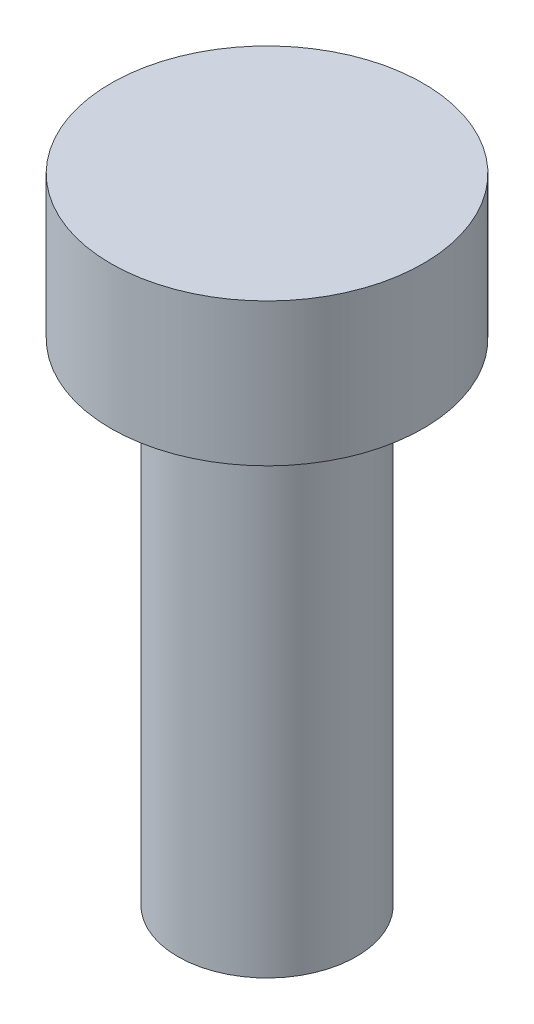
ISO-10303-21;
HEADER;
FILE_DESCRIPTION(('STEP AP214'),'2;1');
FILE_NAME('part.step','',(''),(''),'','','');
FILE_SCHEMA(('AUTOMOTIVE_DESIGN { 1 0 10303 214 1 1 1 1 }'));
ENDSEC;
DATA;
#1=APPLICATION_CONTEXT('core data for automotive mechanical design processes');
#2=APPLICATION_PROTOCOL_DEFINITION('international standard','automotive_design',2000,#1);
#3=PRODUCT_CONTEXT('',#1,'mechanical');
#4=PRODUCT('Part','Part','',(#3));
#5=PRODUCT_RELATED_PRODUCT_CATEGORY('part','',(#4));
#6=PRODUCT_DEFINITION_FORMATION('','',#4);
#7=PRODUCT_DEFINITION_CONTEXT('part definition',#1,'design');
#8=PRODUCT_DEFINITION('design','',#6,#7);
#9=PRODUCT_DEFINITION_SHAPE('','',#8);
#10=(LENGTH_UNIT() NAMED_UNIT(*) SI_UNIT(.MILLI.,.METRE.));
#11=(NAMED_UNIT(*) PLANE_ANGLE_UNIT() SI_UNIT($,.RADIAN.));
#12=(NAMED_UNIT(*) SI_UNIT($,.STERADIAN.) SOLID_ANGLE_UNIT());
#13=UNCERTAINTY_MEASURE_WITH_UNIT(LENGTH_MEASURE(1.E-05),#10,'distance_accuracy_value','');
#14=(GEOMETRIC_REPRESENTATION_CONTEXT(3) GLOBAL_UNCERTAINTY_ASSIGNED_CONTEXT((#13)) GLOBAL_UNIT_ASSIGNED_CONTEXT((#10,
#11,#12)) REPRESENTATION_CONTEXT('',''));
#15=CARTESIAN_POINT('',(0.,0.,0.));
#16=DIRECTION('',(0.,0.,1.));
#17=DIRECTION('',(1.,0.,0.));
#18=AXIS2_PLACEMENT_3D('',#15,#16,#17);
#19=CARTESIAN_POINT('',(0.,1.6,0.));
#20=DIRECTION('',(0.,-1.,0.));
#21=DIRECTION('',(0.,0.,-1.));
#22=AXIS2_PLACEMENT_3D('',#19,#20,#21);
#23=CYLINDRICAL_SURFACE('',#22,1.75);
#24=CARTESIAN_POINT('',(0.,1.6,0.));
#25=DIRECTION('',(0.,1.,0.));
#26=DIRECTION('',(0.,0.,1.));
#27=AXIS2_PLACEMENT_3D('',#24,#25,#26);
#28=CIRCLE('',#27,1.75);
#29=CARTESIAN_POINT('',(0.,1.6,1.75));
#30=VERTEX_POINT('',#29);
#31=EDGE_CURVE('E37',#30,#30,#28,.T.);
#32=ORIENTED_EDGE('',*,*,#31,.F.);
#33=EDGE_LOOP('',(#32));
#34=FACE_BOUND('',#33,.T.);
#35=CARTESIAN_POINT('',(0.,0.,0.));
#36=DIRECTION('',(0.,1.,0.));
#37=DIRECTION('',(0.,0.,1.));
#38=AXIS2_PLACEMENT_3D('',#35,#36,#37);
#39=CIRCLE('',#38,1.75);
#40=CARTESIAN_POINT('',(0.,0.,1.75));
#41=VERTEX_POINT('',#40);
#42=EDGE_CURVE('E33',#41,#41,#39,.T.);
#43=ORIENTED_EDGE('',*,*,#42,.T.);
#44=EDGE_LOOP('',(#43));
#45=FACE_BOUND('',#44,.T.);
#46=ADVANCED_FACE('F30',(#34,#45),#23,.T.);
#47=CARTESIAN_POINT('',(0.,1.6,0.));
#48=DIRECTION('',(0.,1.,0.));
#49=DIRECTION('',(0.,0.,1.));
#50=AXIS2_PLACEMENT_3D('',#47,#48,#49);
#51=PLANE('',#50);
#52=ORIENTED_EDGE('',*,*,#31,.T.);
#53=EDGE_LOOP('',(#52));
#54=FACE_BOUND('',#53,.T.);
#55=ADVANCED_FACE('F54',(#54),#51,.T.);
#56=CARTESIAN_POINT('',(0.,0.,0.));
#57=DIRECTION('',(0.,1.,0.));
#58=DIRECTION('',(0.,0.,1.));
#59=AXIS2_PLACEMENT_3D('',#56,#57,#58);
#60=PLANE('',#59);
#61=CARTESIAN_POINT('',(0.,0.,0.));
#62=DIRECTION('',(0.,-1.,0.));
#63=DIRECTION('',(0.,0.,-1.));
#64=AXIS2_PLACEMENT_3D('',#61,#62,#63);
#65=CIRCLE('',#64,1.);
#66=CARTESIAN_POINT('',(0.,0.,-1.));
#67=VERTEX_POINT('',#66);
#68=EDGE_CURVE('E10',#67,#67,#65,.T.);
#69=ORIENTED_EDGE('',*,*,#68,.F.);
#70=EDGE_LOOP('',(#69));
#71=FACE_BOUND('',#70,.T.);
#72=ORIENTED_EDGE('',*,*,#42,.F.);
#73=EDGE_LOOP('',(#72));
#74=FACE_BOUND('',#73,.T.);
#75=ADVANCED_FACE('F51',(#71,#74),#60,.F.);
#76=CARTESIAN_POINT('',(0.,-5.5,0.));
#77=DIRECTION('',(0.,1.,0.));
#78=DIRECTION('',(0.,0.,1.));
#79=AXIS2_PLACEMENT_3D('',#76,#77,#78);
#80=CYLINDRICAL_SURFACE('',#79,1.);
#81=CARTESIAN_POINT('',(0.,-5.5,0.));
#82=DIRECTION('',(0.,-1.,0.));
#83=DIRECTION('',(0.,0.,-1.));
#84=AXIS2_PLACEMENT_3D('',#81,#82,#83);
#85=CIRCLE('',#84,1.);
#86=CARTESIAN_POINT('',(0.,-5.5,-1.));
#87=VERTEX_POINT('',#86);
#88=EDGE_CURVE('E43',#87,#87,#85,.T.);
#89=ORIENTED_EDGE('',*,*,#88,.F.);
#90=EDGE_LOOP('',(#89));
#91=FACE_BOUND('',#90,.T.);
#92=ORIENTED_EDGE('',*,*,#68,.T.);
#93=EDGE_LOOP('',(#92));
#94=FACE_BOUND('',#93,.T.);
#95=ADVANCED_FACE('F53',(#91,#94),#80,.T.);
#96=CARTESIAN_POINT('',(0.,-5.5,0.));
#97=DIRECTION('',(0.,-1.,0.));
#98=DIRECTION('',(0.,0.,-1.));
#99=AXIS2_PLACEMENT_3D('',#96,#97,#98);
#100=PLANE('',#99);
#101=ORIENTED_EDGE('',*,*,#88,.T.);
#102=EDGE_LOOP('',(#101));
#103=FACE_BOUND('',#102,.T.);
#104=ADVANCED_FACE('F60',(#103),#100,.T.);
#105=CLOSED_SHELL('',(#46,#55,#75,#95,#104));
#106=MANIFOLD_SOLID_BREP('B2',#105);
#107=ADVANCED_BREP_SHAPE_REPRESENTATION('',(#18,#106),#14);
#108=SHAPE_DEFINITION_REPRESENTATION(#9,#107);
ENDSEC;
END-ISO-10303-21;
